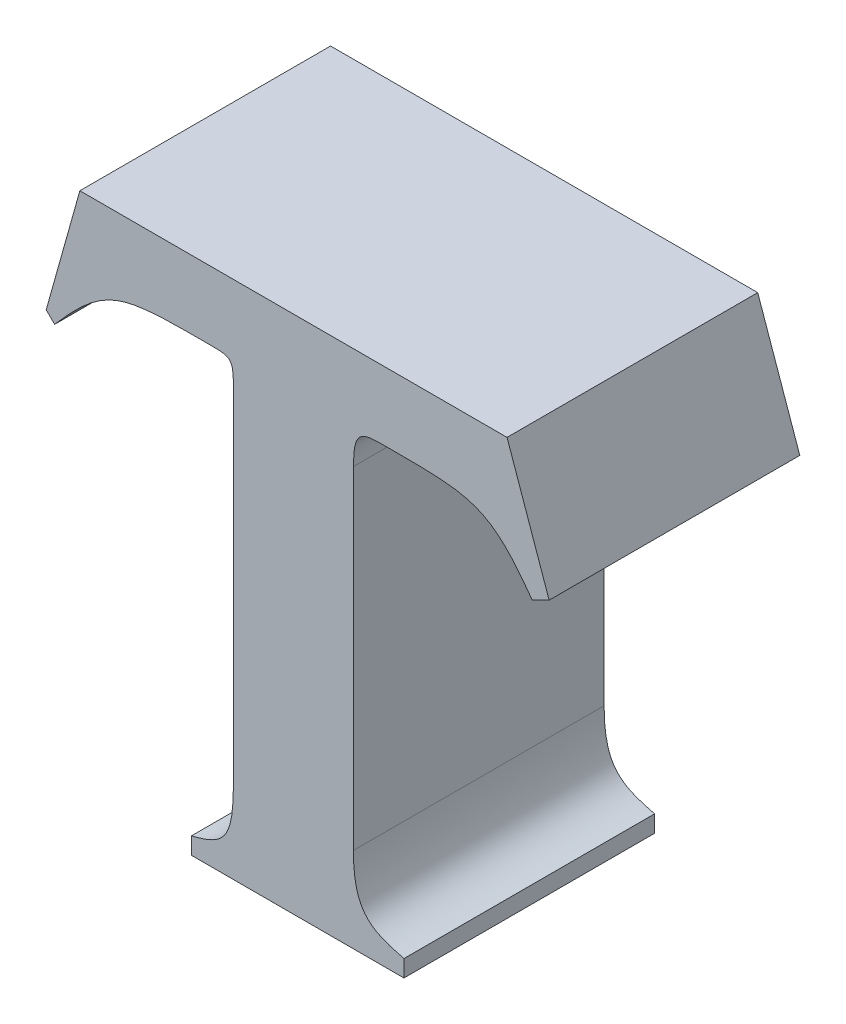
ISO-10303-21;
HEADER;
FILE_DESCRIPTION(('STEP AP214'),'2;1');
FILE_NAME('part.step','',(''),(''),'','','');
FILE_SCHEMA(('AUTOMOTIVE_DESIGN { 1 0 10303 214 1 1 1 1 }'));
ENDSEC;
DATA;
#1=APPLICATION_CONTEXT('core data for automotive mechanical design processes');
#2=APPLICATION_PROTOCOL_DEFINITION('international standard','automotive_design',2000,#1);
#3=PRODUCT_CONTEXT('',#1,'mechanical');
#4=PRODUCT('Part','Part','',(#3));
#5=PRODUCT_RELATED_PRODUCT_CATEGORY('part','',(#4));
#6=PRODUCT_DEFINITION_FORMATION('','',#4);
#7=PRODUCT_DEFINITION_CONTEXT('part definition',#1,'design');
#8=PRODUCT_DEFINITION('design','',#6,#7);
#9=PRODUCT_DEFINITION_SHAPE('','',#8);
#10=(LENGTH_UNIT() NAMED_UNIT(*) SI_UNIT(.MILLI.,.METRE.));
#11=(NAMED_UNIT(*) PLANE_ANGLE_UNIT() SI_UNIT($,.RADIAN.));
#12=(NAMED_UNIT(*) SI_UNIT($,.STERADIAN.) SOLID_ANGLE_UNIT());
#13=UNCERTAINTY_MEASURE_WITH_UNIT(LENGTH_MEASURE(1.E-05),#10,'distance_accuracy_value','');
#14=(GEOMETRIC_REPRESENTATION_CONTEXT(3) GLOBAL_UNCERTAINTY_ASSIGNED_CONTEXT((#13)) GLOBAL_UNIT_ASSIGNED_CONTEXT((#10,
#11,#12)) REPRESENTATION_CONTEXT('',''));
#15=CARTESIAN_POINT('',(0.,0.,0.));
#16=DIRECTION('',(0.,0.,1.));
#17=DIRECTION('',(1.,0.,0.));
#18=AXIS2_PLACEMENT_3D('',#15,#16,#17);
#19=CARTESIAN_POINT('',(1.345416638483,-0.25323453724898,0.));
#20=DIRECTION('',(-0.962788785252708,0.270254981437188,0.));
#21=DIRECTION('',(-0.270254981437188,-0.962788785252708,0.));
#22=AXIS2_PLACEMENT_3D('',#19,#20,#21);
#23=PLANE('',#22);
#24=DIRECTION('',(0.270254981437188,0.962788785252708,0.));
#25=VECTOR('',#24,1.);
#26=CARTESIAN_POINT('',(1.331985776334,-0.301082252706,0.));
#27=LINE('',#26,#25);
#28=CARTESIAN_POINT('',(1.331985776334,-0.301082252706,0.));
#29=VERTEX_POINT('',#28);
#30=CARTESIAN_POINT('',(1.345416638483,-0.25323453724898,0.));
#31=VERTEX_POINT('',#30);
#32=EDGE_CURVE('E11',#29,#31,#27,.T.);
#33=ORIENTED_EDGE('',*,*,#32,.F.);
#34=DIRECTION('',(0.,0.,1.));
#35=VECTOR('',#34,1.);
#36=CARTESIAN_POINT('',(1.331985776334,-0.301082252706,0.));
#37=LINE('',#36,#35);
#38=CARTESIAN_POINT('',(1.331985776334,-0.301082252706,0.1));
#39=VERTEX_POINT('',#38);
#40=EDGE_CURVE('E24',#29,#39,#37,.T.);
#41=ORIENTED_EDGE('',*,*,#40,.T.);
#42=DIRECTION('',(-0.270254981437188,-0.962788785252708,0.));
#43=VECTOR('',#42,1.);
#44=CARTESIAN_POINT('',(1.331985776334,-0.301082252706,0.1));
#45=LINE('',#44,#43);
#46=CARTESIAN_POINT('',(1.345416638483,-0.25323453724898,0.1));
#47=VERTEX_POINT('',#46);
#48=EDGE_CURVE('E148',#47,#39,#45,.T.);
#49=ORIENTED_EDGE('',*,*,#48,.F.);
#50=DIRECTION('',(0.,0.,1.));
#51=VECTOR('',#50,1.);
#52=CARTESIAN_POINT('',(1.345416638483,-0.25323453724898,0.));
#53=LINE('',#52,#51);
#54=EDGE_CURVE('E313',#31,#47,#53,.T.);
#55=ORIENTED_EDGE('',*,*,#54,.F.);
#56=EDGE_LOOP('',(#33,#41,#49,#55));
#57=FACE_BOUND('',#56,.T.);
#58=ADVANCED_FACE('F17',(#57),#23,.T.);
#59=CARTESIAN_POINT('',(1.515821228399,-0.25323453724898,0.));
#60=DIRECTION('',(0.,1.,0.));
#61=DIRECTION('',(-1.,0.,0.));
#62=AXIS2_PLACEMENT_3D('',#59,#60,#61);
#63=PLANE('',#62);
#64=DIRECTION('',(1.,0.,0.));
#65=VECTOR('',#64,1.);
#66=CARTESIAN_POINT('',(1.345416638483,-0.25323453724898,0.));
#67=LINE('',#66,#65);
#68=CARTESIAN_POINT('',(1.515821228399,-0.25323453724898,0.));
#69=VERTEX_POINT('',#68);
#70=EDGE_CURVE('E311',#31,#69,#67,.T.);
#71=ORIENTED_EDGE('',*,*,#70,.F.);
#72=ORIENTED_EDGE('',*,*,#54,.T.);
#73=DIRECTION('',(-1.,0.,0.));
#74=VECTOR('',#73,1.);
#75=CARTESIAN_POINT('',(1.345416638483,-0.25323453724898,0.1));
#76=LINE('',#75,#74);
#77=CARTESIAN_POINT('',(1.515821228399,-0.25323453724898,0.1));
#78=VERTEX_POINT('',#77);
#79=EDGE_CURVE('E309',#78,#47,#76,.T.);
#80=ORIENTED_EDGE('',*,*,#79,.F.);
#81=DIRECTION('',(0.,0.,1.));
#82=VECTOR('',#81,1.);
#83=CARTESIAN_POINT('',(1.515821228399,-0.25323453724898,0.));
#84=LINE('',#83,#82);
#85=EDGE_CURVE('E306',#69,#78,#84,.T.);
#86=ORIENTED_EDGE('',*,*,#85,.F.);
#87=EDGE_LOOP('',(#71,#72,#80,#86));
#88=FACE_BOUND('',#87,.T.);
#89=ADVANCED_FACE('F367',(#88),#63,.T.);
#90=CARTESIAN_POINT('',(1.532610196017,-0.301082252706,0.));
#91=DIRECTION('',(0.943598161348006,0.331092902220302,0.));
#92=DIRECTION('',(-0.331092902220302,0.943598161348006,0.));
#93=AXIS2_PLACEMENT_3D('',#90,#91,#92);
#94=PLANE('',#93);
#95=DIRECTION('',(0.331092902220302,-0.943598161348006,0.));
#96=VECTOR('',#95,1.);
#97=CARTESIAN_POINT('',(1.515821228399,-0.25323453724898,0.));
#98=LINE('',#97,#96);
#99=CARTESIAN_POINT('',(1.532610196017,-0.301082252706,0.));
#100=VERTEX_POINT('',#99);
#101=EDGE_CURVE('E304',#69,#100,#98,.T.);
#102=ORIENTED_EDGE('',*,*,#101,.F.);
#103=ORIENTED_EDGE('',*,*,#85,.T.);
#104=DIRECTION('',(-0.331092902220302,0.943598161348006,0.));
#105=VECTOR('',#104,1.);
#106=CARTESIAN_POINT('',(1.515821228399,-0.25323453724898,0.1));
#107=LINE('',#106,#105);
#108=CARTESIAN_POINT('',(1.532610196017,-0.301082252706,0.1));
#109=VERTEX_POINT('',#108);
#110=EDGE_CURVE('E301',#109,#78,#107,.T.);
#111=ORIENTED_EDGE('',*,*,#110,.F.);
#112=DIRECTION('',(0.,0.,1.));
#113=VECTOR('',#112,1.);
#114=CARTESIAN_POINT('',(1.532610196017,-0.301082252706,0.));
#115=LINE('',#114,#113);
#116=EDGE_CURVE('E298',#100,#109,#115,.T.);
#117=ORIENTED_EDGE('',*,*,#116,.F.);
#118=EDGE_LOOP('',(#102,#103,#111,#117));
#119=FACE_BOUND('',#118,.T.);
#120=ADVANCED_FACE('F363',(#119),#94,.T.);
#121=CARTESIAN_POINT('',(1.525894920917,-0.304439952646,0.));
#122=DIRECTION('',(0.447220243388609,-0.894423867024709,0.));
#123=DIRECTION('',(0.894423867024709,0.447220243388609,0.));
#124=AXIS2_PLACEMENT_3D('',#121,#122,#123);
#125=PLANE('',#124);
#126=DIRECTION('',(-0.894423867024708,-0.447220243388609,0.));
#127=VECTOR('',#126,1.);
#128=CARTESIAN_POINT('',(1.532610196017,-0.301082252706,0.));
#129=LINE('',#128,#127);
#130=CARTESIAN_POINT('',(1.525894920917,-0.304439952646,0.));
#131=VERTEX_POINT('',#130);
#132=EDGE_CURVE('E296',#100,#131,#129,.T.);
#133=ORIENTED_EDGE('',*,*,#132,.F.);
#134=ORIENTED_EDGE('',*,*,#116,.T.);
#135=DIRECTION('',(0.894423867024708,0.447220243388609,0.));
#136=VECTOR('',#135,1.);
#137=CARTESIAN_POINT('',(1.532610196017,-0.301082252706,0.1));
#138=LINE('',#137,#136);
#139=CARTESIAN_POINT('',(1.525894920917,-0.304439952646,0.1));
#140=VERTEX_POINT('',#139);
#141=EDGE_CURVE('E293',#140,#109,#138,.T.);
#142=ORIENTED_EDGE('',*,*,#141,.F.);
#143=DIRECTION('',(0.,0.,1.));
#144=VECTOR('',#143,1.);
#145=CARTESIAN_POINT('',(1.525894920917,-0.304439952646,0.));
#146=LINE('',#145,#144);
#147=EDGE_CURVE('E287',#131,#140,#146,.T.);
#148=ORIENTED_EDGE('',*,*,#147,.F.);
#149=EDGE_LOOP('',(#133,#134,#142,#148));
#150=FACE_BOUND('',#149,.T.);
#151=ADVANCED_FACE('F359',(#150),#125,.T.);
#152=CARTESIAN_POINT('',(1.467973294579,-0.28051607931998,0.));
#153=CARTESIAN_POINT('',(1.467973294579,-0.28051607931998,0.1));
#154=CARTESIAN_POINT('',(1.501971421927,-0.280516079319981,0.));
#155=CARTESIAN_POINT('',(1.501971421927,-0.280516079319981,0.1));
#156=CARTESIAN_POINT('',(1.508687008974,-0.28051607931998,0.));
#157=CARTESIAN_POINT('',(1.508687008974,-0.28051607931998,0.1));
#158=CARTESIAN_POINT('',(1.525894920917,-0.304439952646,0.));
#159=CARTESIAN_POINT('',(1.525894920917,-0.304439952646,0.1));
#160=B_SPLINE_SURFACE_WITH_KNOTS('',3,1,((#152,#153),(#154,#155),(#156,#157),(#158,#159)),
.UNSPECIFIED.,.F.,.F.,.F.,(4,4),(2,2),(-1.,0.),(0.,0.01),.UNSPECIFIED.);
#161=CARTESIAN_POINT('',(1.525894920917,-0.304439952646,0.));
#162=CARTESIAN_POINT('',(1.508687008974,-0.28051607931998,0.));
#163=CARTESIAN_POINT('',(1.501971421927,-0.280516079319981,0.));
#164=CARTESIAN_POINT('',(1.467973294579,-0.28051607931998,0.));
#165=B_SPLINE_CURVE_WITH_KNOTS('',3,(#161,#162,#163,#164),.UNSPECIFIED.,.F.,.F.,(4,4),(0.,1.),.UNSPECIFIED.);
#166=CARTESIAN_POINT('',(1.467973294579,-0.28051607931998,0.));
#167=VERTEX_POINT('',#166);
#168=EDGE_CURVE('E280',#131,#167,#165,.T.);
#169=CARTESIAN_POINT('',(1.467973294579,-0.28051607931998,0.1));
#170=CARTESIAN_POINT('',(1.501971421927,-0.280516079319981,0.1));
#171=CARTESIAN_POINT('',(1.508687008974,-0.28051607931998,0.1));
#172=CARTESIAN_POINT('',(1.525894920917,-0.304439952646,0.1));
#173=B_SPLINE_CURVE_WITH_KNOTS('',3,(#169,#170,#171,#172),.UNSPECIFIED.,.F.,.F.,(4,4),(-1.,0.),.UNSPECIFIED.);
#174=CARTESIAN_POINT('',(1.467973294579,-0.28051607931998,0.1));
#175=VERTEX_POINT('',#174);
#176=EDGE_CURVE('E275',#175,#140,#173,.T.);
#177=DIRECTION('',(0.,0.,1.));
#178=VECTOR('',#177,1.);
#179=CARTESIAN_POINT('',(1.467973294579,-0.28051607931998,0.));
#180=LINE('',#179,#178);
#181=EDGE_CURVE('E269',#167,#175,#180,.T.);
#182=ORIENTED_EDGE('',*,*,#168,.F.);
#183=ORIENTED_EDGE('',*,*,#147,.T.);
#184=ORIENTED_EDGE('',*,*,#176,.F.);
#185=ORIENTED_EDGE('',*,*,#181,.F.);
#186=EDGE_LOOP('',(#182,#183,#184,#185));
#187=FACE_BOUND('',#186,.T.);
#188=ADVANCED_FACE('F355',(#187),#160,.T.);
#189=CARTESIAN_POINT('',(1.454542744377,-0.29394706624691,0.));
#190=CARTESIAN_POINT('',(1.454542744377,-0.29394706624691,0.1));
#191=CARTESIAN_POINT('',(1.454542744377,-0.280516079319981,0.));
#192=CARTESIAN_POINT('',(1.454542744377,-0.280516079319981,0.1));
#193=CARTESIAN_POINT('',(1.457900849848,-0.280516079319981,0.));
#194=CARTESIAN_POINT('',(1.457900849848,-0.280516079319981,0.1));
#195=CARTESIAN_POINT('',(1.467973294579,-0.28051607931998,0.));
#196=CARTESIAN_POINT('',(1.467973294579,-0.28051607931998,0.1));
#197=B_SPLINE_SURFACE_WITH_KNOTS('',3,1,((#189,#190),(#191,#192),(#193,#194),(#195,#196)),
.UNSPECIFIED.,.F.,.F.,.F.,(4,4),(2,2),(-1.,0.),(0.,0.01),.UNSPECIFIED.);
#198=CARTESIAN_POINT('',(1.467973294579,-0.28051607931998,0.));
#199=CARTESIAN_POINT('',(1.457900849848,-0.280516079319981,0.));
#200=CARTESIAN_POINT('',(1.454542744377,-0.280516079319981,0.));
#201=CARTESIAN_POINT('',(1.454542744377,-0.29394706624691,0.));
#202=B_SPLINE_CURVE_WITH_KNOTS('',3,(#198,#199,#200,#201),.UNSPECIFIED.,.F.,.F.,(4,4),(0.,1.),.UNSPECIFIED.);
#203=CARTESIAN_POINT('',(1.454542744377,-0.29394706624691,0.));
#204=VERTEX_POINT('',#203);
#205=EDGE_CURVE('E262',#167,#204,#202,.T.);
#206=CARTESIAN_POINT('',(1.454542744377,-0.29394706624691,0.1));
#207=CARTESIAN_POINT('',(1.454542744377,-0.280516079319981,0.1));
#208=CARTESIAN_POINT('',(1.457900849848,-0.280516079319981,0.1));
#209=CARTESIAN_POINT('',(1.467973294579,-0.28051607931998,0.1));
#210=B_SPLINE_CURVE_WITH_KNOTS('',3,(#206,#207,#208,#209),.UNSPECIFIED.,.F.,.F.,(4,4),(-1.,0.),.UNSPECIFIED.);
#211=CARTESIAN_POINT('',(1.454542744377,-0.29394706624691,0.1));
#212=VERTEX_POINT('',#211);
#213=EDGE_CURVE('E257',#212,#175,#210,.T.);
#214=DIRECTION('',(0.,0.,1.));
#215=VECTOR('',#214,1.);
#216=CARTESIAN_POINT('',(1.454542744377,-0.29394706624691,0.));
#217=LINE('',#216,#215);
#218=EDGE_CURVE('E254',#204,#212,#217,.T.);
#219=ORIENTED_EDGE('',*,*,#205,.F.);
#220=ORIENTED_EDGE('',*,*,#181,.T.);
#221=ORIENTED_EDGE('',*,*,#213,.F.);
#222=ORIENTED_EDGE('',*,*,#218,.F.);
#223=EDGE_LOOP('',(#219,#220,#221,#222));
#224=FACE_BOUND('',#223,.T.);
#225=ADVANCED_FACE('F351',(#224),#197,.T.);
#226=CARTESIAN_POINT('',(1.454542744377,-0.426577508445,0.));
#227=DIRECTION('',(1.,0.,0.));
#228=DIRECTION('',(0.,1.,0.));
#229=AXIS2_PLACEMENT_3D('',#226,#227,#228);
#230=PLANE('',#229);
#231=DIRECTION('',(0.,-1.,0.));
#232=VECTOR('',#231,1.);
#233=CARTESIAN_POINT('',(1.454542744377,-0.29394706624691,0.));
#234=LINE('',#233,#232);
#235=CARTESIAN_POINT('',(1.454542744377,-0.426577508445,0.));
#236=VERTEX_POINT('',#235);
#237=EDGE_CURVE('E252',#204,#236,#234,.T.);
#238=ORIENTED_EDGE('',*,*,#237,.F.);
#239=ORIENTED_EDGE('',*,*,#218,.T.);
#240=DIRECTION('',(0.,1.,0.));
#241=VECTOR('',#240,1.);
#242=CARTESIAN_POINT('',(1.454542744377,-0.29394706624691,0.1));
#243=LINE('',#242,#241);
#244=CARTESIAN_POINT('',(1.454542744377,-0.426577508445,0.1));
#245=VERTEX_POINT('',#244);
#246=EDGE_CURVE('E249',#245,#212,#243,.T.);
#247=ORIENTED_EDGE('',*,*,#246,.F.);
#248=DIRECTION('',(0.,0.,1.));
#249=VECTOR('',#248,1.);
#250=CARTESIAN_POINT('',(1.454542744377,-0.426577508445,0.));
#251=LINE('',#250,#249);
#252=EDGE_CURVE('E243',#236,#245,#251,.T.);
#253=ORIENTED_EDGE('',*,*,#252,.F.);
#254=EDGE_LOOP('',(#238,#239,#247,#253));
#255=FACE_BOUND('',#254,.T.);
#256=ADVANCED_FACE('F347',(#255),#230,.T.);
#257=CARTESIAN_POINT('',(1.474688881626,-0.453859050516,0.));
#258=CARTESIAN_POINT('',(1.474688881626,-0.453859050516,0.1));
#259=CARTESIAN_POINT('',(1.461258019478,-0.450501256992,0.));
#260=CARTESIAN_POINT('',(1.461258019478,-0.450501256992,0.1));
#261=CARTESIAN_POINT('',(1.454542744377,-0.447143557053,0.));
#262=CARTESIAN_POINT('',(1.454542744377,-0.447143557053,0.1));
#263=CARTESIAN_POINT('',(1.454542744377,-0.426577508445,0.));
#264=CARTESIAN_POINT('',(1.454542744377,-0.426577508445,0.1));
#265=B_SPLINE_SURFACE_WITH_KNOTS('',3,1,((#257,#258),(#259,#260),(#261,#262),(#263,#264)),
.UNSPECIFIED.,.F.,.F.,.F.,(4,4),(2,2),(-1.,0.),(0.,0.01),.UNSPECIFIED.);
#266=CARTESIAN_POINT('',(1.454542744377,-0.426577508445,0.));
#267=CARTESIAN_POINT('',(1.454542744377,-0.447143557053,0.));
#268=CARTESIAN_POINT('',(1.461258019478,-0.450501256992,0.));
#269=CARTESIAN_POINT('',(1.474688881626,-0.453859050516,0.));
#270=B_SPLINE_CURVE_WITH_KNOTS('',3,(#266,#267,#268,#269),.UNSPECIFIED.,.F.,.F.,(4,4),(0.,1.),.UNSPECIFIED.);
#271=CARTESIAN_POINT('',(1.474688881626,-0.453859050516,0.));
#272=VERTEX_POINT('',#271);
#273=EDGE_CURVE('E236',#236,#272,#270,.T.);
#274=CARTESIAN_POINT('',(1.474688881626,-0.453859050516,0.1));
#275=CARTESIAN_POINT('',(1.461258019478,-0.450501256992,0.1));
#276=CARTESIAN_POINT('',(1.454542744377,-0.447143557053,0.1));
#277=CARTESIAN_POINT('',(1.454542744377,-0.426577508445,0.1));
#278=B_SPLINE_CURVE_WITH_KNOTS('',3,(#274,#275,#276,#277),.UNSPECIFIED.,.F.,.F.,(4,4),(-1.,0.),.UNSPECIFIED.);
#279=CARTESIAN_POINT('',(1.474688881626,-0.453859050516,0.1));
#280=VERTEX_POINT('',#279);
#281=EDGE_CURVE('E231',#280,#245,#278,.T.);
#282=DIRECTION('',(0.,0.,1.));
#283=VECTOR('',#282,1.);
#284=CARTESIAN_POINT('',(1.474688881626,-0.453859050516,0.));
#285=LINE('',#284,#283);
#286=EDGE_CURVE('E228',#272,#280,#285,.T.);
#287=ORIENTED_EDGE('',*,*,#273,.F.);
#288=ORIENTED_EDGE('',*,*,#252,.T.);
#289=ORIENTED_EDGE('',*,*,#281,.F.);
#290=ORIENTED_EDGE('',*,*,#286,.F.);
#291=EDGE_LOOP('',(#287,#288,#289,#290));
#292=FACE_BOUND('',#291,.T.);
#293=ADVANCED_FACE('F343',(#292),#265,.T.);
#294=CARTESIAN_POINT('',(1.474688881626,-0.46057454398,0.));
#295=DIRECTION('',(1.,0.,0.));
#296=DIRECTION('',(0.,1.,0.));
#297=AXIS2_PLACEMENT_3D('',#294,#295,#296);
#298=PLANE('',#297);
#299=DIRECTION('',(0.,-1.,0.));
#300=VECTOR('',#299,1.);
#301=CARTESIAN_POINT('',(1.474688881626,-0.453859050516,0.));
#302=LINE('',#301,#300);
#303=CARTESIAN_POINT('',(1.474688881626,-0.46057454398,0.));
#304=VERTEX_POINT('',#303);
#305=EDGE_CURVE('E226',#272,#304,#302,.T.);
#306=ORIENTED_EDGE('',*,*,#305,.F.);
#307=ORIENTED_EDGE('',*,*,#286,.T.);
#308=DIRECTION('',(0.,1.,0.));
#309=VECTOR('',#308,1.);
#310=CARTESIAN_POINT('',(1.474688881626,-0.453859050516,0.1));
#311=LINE('',#310,#309);
#312=CARTESIAN_POINT('',(1.474688881626,-0.46057454398,0.1));
#313=VERTEX_POINT('',#312);
#314=EDGE_CURVE('E223',#313,#280,#311,.T.);
#315=ORIENTED_EDGE('',*,*,#314,.F.);
#316=DIRECTION('',(0.,0.,1.));
#317=VECTOR('',#316,1.);
#318=CARTESIAN_POINT('',(1.474688881626,-0.46057454398,0.));
#319=LINE('',#318,#317);
#320=EDGE_CURVE('E220',#304,#313,#319,.T.);
#321=ORIENTED_EDGE('',*,*,#320,.F.);
#322=EDGE_LOOP('',(#306,#307,#315,#321));
#323=FACE_BOUND('',#322,.T.);
#324=ADVANCED_FACE('F339',(#323),#298,.T.);
#325=CARTESIAN_POINT('',(1.389907090725,-0.46057454398,0.));
#326=DIRECTION('',(0.,-1.,0.));
#327=DIRECTION('',(1.,0.,0.));
#328=AXIS2_PLACEMENT_3D('',#325,#326,#327);
#329=PLANE('',#328);
#330=DIRECTION('',(-1.,0.,0.));
#331=VECTOR('',#330,1.);
#332=CARTESIAN_POINT('',(1.474688881626,-0.46057454398,0.));
#333=LINE('',#332,#331);
#334=CARTESIAN_POINT('',(1.389907090725,-0.46057454398,0.));
#335=VERTEX_POINT('',#334);
#336=EDGE_CURVE('E218',#304,#335,#333,.T.);
#337=ORIENTED_EDGE('',*,*,#336,.F.);
#338=ORIENTED_EDGE('',*,*,#320,.T.);
#339=DIRECTION('',(1.,0.,0.));
#340=VECTOR('',#339,1.);
#341=CARTESIAN_POINT('',(1.474688881626,-0.46057454398,0.1));
#342=LINE('',#341,#340);
#343=CARTESIAN_POINT('',(1.389907090725,-0.46057454398,0.1));
#344=VERTEX_POINT('',#343);
#345=EDGE_CURVE('E215',#344,#313,#342,.T.);
#346=ORIENTED_EDGE('',*,*,#345,.F.);
#347=DIRECTION('',(0.,0.,1.));
#348=VECTOR('',#347,1.);
#349=CARTESIAN_POINT('',(1.389907090725,-0.46057454398,0.));
#350=LINE('',#349,#348);
#351=EDGE_CURVE('E212',#335,#344,#350,.T.);
#352=ORIENTED_EDGE('',*,*,#351,.F.);
#353=EDGE_LOOP('',(#337,#338,#346,#352));
#354=FACE_BOUND('',#353,.T.);
#355=ADVANCED_FACE('F335',(#354),#329,.T.);
#356=CARTESIAN_POINT('',(1.389907090725,-0.453859050516,0.));
#357=DIRECTION('',(-1.,0.,0.));
#358=DIRECTION('',(0.,-1.,0.));
#359=AXIS2_PLACEMENT_3D('',#356,#357,#358);
#360=PLANE('',#359);
#361=DIRECTION('',(0.,1.,0.));
#362=VECTOR('',#361,1.);
#363=CARTESIAN_POINT('',(1.389907090725,-0.46057454398,0.));
#364=LINE('',#363,#362);
#365=CARTESIAN_POINT('',(1.389907090725,-0.453859050516,0.));
#366=VERTEX_POINT('',#365);
#367=EDGE_CURVE('E210',#335,#366,#364,.T.);
#368=ORIENTED_EDGE('',*,*,#367,.F.);
#369=ORIENTED_EDGE('',*,*,#351,.T.);
#370=DIRECTION('',(0.,-1.,0.));
#371=VECTOR('',#370,1.);
#372=CARTESIAN_POINT('',(1.389907090725,-0.46057454398,0.1));
#373=LINE('',#372,#371);
#374=CARTESIAN_POINT('',(1.389907090725,-0.453859050516,0.1));
#375=VERTEX_POINT('',#374);
#376=EDGE_CURVE('E207',#375,#344,#373,.T.);
#377=ORIENTED_EDGE('',*,*,#376,.F.);
#378=DIRECTION('',(0.,0.,1.));
#379=VECTOR('',#378,1.);
#380=CARTESIAN_POINT('',(1.389907090725,-0.453859050516,0.));
#381=LINE('',#380,#379);
#382=EDGE_CURVE('E201',#366,#375,#381,.T.);
#383=ORIENTED_EDGE('',*,*,#382,.F.);
#384=EDGE_LOOP('',(#368,#369,#377,#383));
#385=FACE_BOUND('',#384,.T.);
#386=ADVANCED_FACE('F331',(#385),#360,.T.);
#387=CARTESIAN_POINT('',(1.406695122504,-0.426577508445,0.));
#388=CARTESIAN_POINT('',(1.406695122504,-0.426577508445,0.1));
#389=CARTESIAN_POINT('',(1.406695122504,-0.447143557053,0.));
#390=CARTESIAN_POINT('',(1.406695122504,-0.447143557053,0.1));
#391=CARTESIAN_POINT('',(1.403337952874,-0.450501256992,0.));
#392=CARTESIAN_POINT('',(1.403337952874,-0.450501256992,0.1));
#393=CARTESIAN_POINT('',(1.389907090725,-0.453859050516,0.));
#394=CARTESIAN_POINT('',(1.389907090725,-0.453859050516,0.1));
#395=B_SPLINE_SURFACE_WITH_KNOTS('',3,1,((#387,#388),(#389,#390),(#391,#392),(#393,#394)),
.UNSPECIFIED.,.F.,.F.,.F.,(4,4),(2,2),(-1.,0.),(0.,0.01),.UNSPECIFIED.);
#396=CARTESIAN_POINT('',(1.389907090725,-0.453859050516,0.));
#397=CARTESIAN_POINT('',(1.403337952874,-0.450501256992,0.));
#398=CARTESIAN_POINT('',(1.406695122504,-0.447143557053,0.));
#399=CARTESIAN_POINT('',(1.406695122504,-0.426577508445,0.));
#400=B_SPLINE_CURVE_WITH_KNOTS('',3,(#396,#397,#398,#399),.UNSPECIFIED.,.F.,.F.,(4,4),(0.,1.),.UNSPECIFIED.);
#401=CARTESIAN_POINT('',(1.406695122504,-0.426577508445,0.));
#402=VERTEX_POINT('',#401);
#403=EDGE_CURVE('E194',#366,#402,#400,.T.);
#404=CARTESIAN_POINT('',(1.406695122504,-0.426577508445,0.1));
#405=CARTESIAN_POINT('',(1.406695122504,-0.447143557053,0.1));
#406=CARTESIAN_POINT('',(1.403337952874,-0.450501256992,0.1));
#407=CARTESIAN_POINT('',(1.389907090725,-0.453859050516,0.1));
#408=B_SPLINE_CURVE_WITH_KNOTS('',3,(#404,#405,#406,#407),.UNSPECIFIED.,.F.,.F.,(4,4),(-1.,0.),.UNSPECIFIED.);
#409=CARTESIAN_POINT('',(1.406695122504,-0.426577508445,0.1));
#410=VERTEX_POINT('',#409);
#411=EDGE_CURVE('E189',#410,#375,#408,.T.);
#412=DIRECTION('',(0.,0.,1.));
#413=VECTOR('',#412,1.);
#414=CARTESIAN_POINT('',(1.406695122504,-0.426577508445,0.));
#415=LINE('',#414,#413);
#416=EDGE_CURVE('E186',#402,#410,#415,.T.);
#417=ORIENTED_EDGE('',*,*,#403,.F.);
#418=ORIENTED_EDGE('',*,*,#382,.T.);
#419=ORIENTED_EDGE('',*,*,#411,.F.);
#420=ORIENTED_EDGE('',*,*,#416,.F.);
#421=EDGE_LOOP('',(#417,#418,#419,#420));
#422=FACE_BOUND('',#421,.T.);
#423=ADVANCED_FACE('F327',(#422),#395,.T.);
#424=CARTESIAN_POINT('',(1.406695122504,-0.29394706624691,0.));
#425=DIRECTION('',(-1.,0.,0.));
#426=DIRECTION('',(0.,-1.,0.));
#427=AXIS2_PLACEMENT_3D('',#424,#425,#426);
#428=PLANE('',#427);
#429=DIRECTION('',(0.,1.,0.));
#430=VECTOR('',#429,1.);
#431=CARTESIAN_POINT('',(1.406695122504,-0.426577508445,0.));
#432=LINE('',#431,#430);
#433=CARTESIAN_POINT('',(1.406695122504,-0.29394706624691,0.));
#434=VERTEX_POINT('',#433);
#435=EDGE_CURVE('E184',#402,#434,#432,.T.);
#436=ORIENTED_EDGE('',*,*,#435,.F.);
#437=ORIENTED_EDGE('',*,*,#416,.T.);
#438=DIRECTION('',(0.,-1.,0.));
#439=VECTOR('',#438,1.);
#440=CARTESIAN_POINT('',(1.406695122504,-0.426577508445,0.1));
#441=LINE('',#440,#439);
#442=CARTESIAN_POINT('',(1.406695122504,-0.29394706624691,0.1));
#443=VERTEX_POINT('',#442);
#444=EDGE_CURVE('E181',#443,#410,#441,.T.);
#445=ORIENTED_EDGE('',*,*,#444,.F.);
#446=DIRECTION('',(0.,0.,1.));
#447=VECTOR('',#446,1.);
#448=CARTESIAN_POINT('',(1.406695122504,-0.29394706624691,0.));
#449=LINE('',#448,#447);
#450=EDGE_CURVE('E175',#434,#443,#449,.T.);
#451=ORIENTED_EDGE('',*,*,#450,.F.);
#452=EDGE_LOOP('',(#436,#437,#445,#451));
#453=FACE_BOUND('',#452,.T.);
#454=ADVANCED_FACE('F323',(#453),#428,.T.);
#455=CARTESIAN_POINT('',(1.396622677773,-0.28051607931998,0.));
#456=CARTESIAN_POINT('',(1.396622677773,-0.28051607931998,0.1));
#457=CARTESIAN_POINT('',(1.406695122504,-0.28051607931998,0.));
#458=CARTESIAN_POINT('',(1.406695122504,-0.28051607931998,0.1));
#459=CARTESIAN_POINT('',(1.406695122504,-0.28051607931998,0.));
#460=CARTESIAN_POINT('',(1.406695122504,-0.28051607931998,0.1));
#461=CARTESIAN_POINT('',(1.406695122504,-0.29394706624691,0.));
#462=CARTESIAN_POINT('',(1.406695122504,-0.29394706624691,0.1));
#463=B_SPLINE_SURFACE_WITH_KNOTS('',3,1,((#455,#456),(#457,#458),(#459,#460),(#461,#462)),
.UNSPECIFIED.,.F.,.F.,.F.,(4,4),(2,2),(-1.,0.),(0.,0.01),.UNSPECIFIED.);
#464=CARTESIAN_POINT('',(1.406695122504,-0.29394706624691,0.));
#465=CARTESIAN_POINT('',(1.406695122504,-0.28051607931998,0.));
#466=CARTESIAN_POINT('',(1.406695122504,-0.28051607931998,0.));
#467=CARTESIAN_POINT('',(1.396622677773,-0.28051607931998,0.));
#468=B_SPLINE_CURVE_WITH_KNOTS('',3,(#464,#465,#466,#467),.UNSPECIFIED.,.F.,.F.,(4,4),(0.,1.),.UNSPECIFIED.);
#469=CARTESIAN_POINT('',(1.396622677773,-0.28051607931998,0.));
#470=VERTEX_POINT('',#469);
#471=EDGE_CURVE('E168',#434,#470,#468,.T.);
#472=CARTESIAN_POINT('',(1.396622677773,-0.28051607931998,0.1));
#473=CARTESIAN_POINT('',(1.406695122504,-0.28051607931998,0.1));
#474=CARTESIAN_POINT('',(1.406695122504,-0.28051607931998,0.1));
#475=CARTESIAN_POINT('',(1.406695122504,-0.29394706624691,0.1));
#476=B_SPLINE_CURVE_WITH_KNOTS('',3,(#472,#473,#474,#475),.UNSPECIFIED.,.F.,.F.,(4,4),(-1.,0.),.UNSPECIFIED.);
#477=CARTESIAN_POINT('',(1.396622677773,-0.28051607931998,0.1));
#478=VERTEX_POINT('',#477);
#479=EDGE_CURVE('E164',#478,#443,#476,.T.);
#480=DIRECTION('',(0.,0.,1.));
#481=VECTOR('',#480,1.);
#482=CARTESIAN_POINT('',(1.396622677773,-0.28051607931998,0.));
#483=LINE('',#482,#481);
#484=EDGE_CURVE('E133',#470,#478,#483,.T.);
#485=ORIENTED_EDGE('',*,*,#471,.F.);
#486=ORIENTED_EDGE('',*,*,#450,.T.);
#487=ORIENTED_EDGE('',*,*,#479,.F.);
#488=ORIENTED_EDGE('',*,*,#484,.F.);
#489=EDGE_LOOP('',(#485,#486,#487,#488));
#490=FACE_BOUND('',#489,.T.);
#491=ADVANCED_FACE('F321',(#490),#463,.T.);
#492=CARTESIAN_POINT('',(1.335344193751,-0.304439952646,0.));
#493=CARTESIAN_POINT('',(1.335344193751,-0.304439952646,0.1));
#494=CARTESIAN_POINT('',(1.355908963378,-0.28051607931998,0.));
#495=CARTESIAN_POINT('',(1.355908963378,-0.28051607931998,0.1));
#496=CARTESIAN_POINT('',(1.362625486265,-0.280516079319981,0.));
#497=CARTESIAN_POINT('',(1.362625486265,-0.280516079319981,0.1));
#498=CARTESIAN_POINT('',(1.396622677773,-0.28051607931998,0.));
#499=CARTESIAN_POINT('',(1.396622677773,-0.28051607931998,0.1));
#500=B_SPLINE_SURFACE_WITH_KNOTS('',3,1,((#492,#493),(#494,#495),(#496,#497),(#498,#499)),
.UNSPECIFIED.,.F.,.F.,.F.,(4,4),(2,2),(-1.,0.),(0.,0.01),.UNSPECIFIED.);
#501=CARTESIAN_POINT('',(1.396622677773,-0.28051607931998,0.));
#502=CARTESIAN_POINT('',(1.362625486265,-0.280516079319981,0.));
#503=CARTESIAN_POINT('',(1.355908963378,-0.28051607931998,0.));
#504=CARTESIAN_POINT('',(1.335344193751,-0.304439952646,0.));
#505=B_SPLINE_CURVE_WITH_KNOTS('',3,(#501,#502,#503,#504),.UNSPECIFIED.,.F.,.F.,(4,4),(0.,1.),.UNSPECIFIED.);
#506=CARTESIAN_POINT('',(1.335344193751,-0.304439952646,0.));
#507=VERTEX_POINT('',#506);
#508=EDGE_CURVE('E137',#470,#507,#505,.T.);
#509=CARTESIAN_POINT('',(1.335344193751,-0.304439952646,0.1));
#510=CARTESIAN_POINT('',(1.355908963378,-0.28051607931998,0.1));
#511=CARTESIAN_POINT('',(1.362625486265,-0.280516079319981,0.1));
#512=CARTESIAN_POINT('',(1.396622677773,-0.28051607931998,0.1));
#513=B_SPLINE_CURVE_WITH_KNOTS('',3,(#509,#510,#511,#512),.UNSPECIFIED.,.F.,.F.,(4,4),(-1.,0.),.UNSPECIFIED.);
#514=CARTESIAN_POINT('',(1.335344193751,-0.304439952646,0.1));
#515=VERTEX_POINT('',#514);
#516=EDGE_CURVE('E126',#515,#478,#513,.T.);
#517=DIRECTION('',(0.,0.,1.));
#518=VECTOR('',#517,1.);
#519=CARTESIAN_POINT('',(1.335344193751,-0.304439952646,0.));
#520=LINE('',#519,#518);
#521=EDGE_CURVE('E130',#507,#515,#520,.T.);
#522=ORIENTED_EDGE('',*,*,#508,.F.);
#523=ORIENTED_EDGE('',*,*,#484,.T.);
#524=ORIENTED_EDGE('',*,*,#516,.F.);
#525=ORIENTED_EDGE('',*,*,#521,.F.);
#526=EDGE_LOOP('',(#522,#523,#524,#525));
#527=FACE_BOUND('',#526,.T.);
#528=ADVANCED_FACE('F129',(#527),#500,.T.);
#529=CARTESIAN_POINT('',(1.331985776334,-0.301082252706,0.));
#530=DIRECTION('',(-0.70703123754814,-0.707182316755125,0.));
#531=DIRECTION('',(0.707182316755125,-0.70703123754814,0.));
#532=AXIS2_PLACEMENT_3D('',#529,#530,#531);
#533=PLANE('',#532);
#534=DIRECTION('',(-0.707182316755125,0.70703123754814,0.));
#535=VECTOR('',#534,1.);
#536=CARTESIAN_POINT('',(1.335344193751,-0.304439952646,0.));
#537=LINE('',#536,#535);
#538=EDGE_CURVE('E143',#507,#29,#537,.T.);
#539=ORIENTED_EDGE('',*,*,#538,.F.);
#540=ORIENTED_EDGE('',*,*,#521,.T.);
#541=DIRECTION('',(0.707182316755125,-0.70703123754814,0.));
#542=VECTOR('',#541,1.);
#543=CARTESIAN_POINT('',(1.335344193751,-0.304439952646,0.1));
#544=LINE('',#543,#542);
#545=EDGE_CURVE('E142',#39,#515,#544,.T.);
#546=ORIENTED_EDGE('',*,*,#545,.F.);
#547=ORIENTED_EDGE('',*,*,#40,.F.);
#548=EDGE_LOOP('',(#539,#540,#546,#547));
#549=FACE_BOUND('',#548,.T.);
#550=ADVANCED_FACE('F141',(#549),#533,.T.);
#551=CARTESIAN_POINT('',(1.431516034793,-0.332930909708107,0.));
#552=DIRECTION('',(0.,0.,1.));
#553=DIRECTION('',(1.,0.,0.));
#554=AXIS2_PLACEMENT_3D('',#551,#552,#553);
#555=PLANE('',#554);
#556=ORIENTED_EDGE('',*,*,#538,.T.);
#557=ORIENTED_EDGE('',*,*,#32,.T.);
#558=ORIENTED_EDGE('',*,*,#70,.T.);
#559=ORIENTED_EDGE('',*,*,#101,.T.);
#560=ORIENTED_EDGE('',*,*,#132,.T.);
#561=ORIENTED_EDGE('',*,*,#168,.T.);
#562=ORIENTED_EDGE('',*,*,#205,.T.);
#563=ORIENTED_EDGE('',*,*,#237,.T.);
#564=ORIENTED_EDGE('',*,*,#273,.T.);
#565=ORIENTED_EDGE('',*,*,#305,.T.);
#566=ORIENTED_EDGE('',*,*,#336,.T.);
#567=ORIENTED_EDGE('',*,*,#367,.T.);
#568=ORIENTED_EDGE('',*,*,#403,.T.);
#569=ORIENTED_EDGE('',*,*,#435,.T.);
#570=ORIENTED_EDGE('',*,*,#471,.T.);
#571=ORIENTED_EDGE('',*,*,#508,.T.);
#572=EDGE_LOOP('',(#556,#557,#558,#559,#560,#561,#562,#563,#564,#565,#566,#567,#568,#569,#570,#571));
#573=FACE_BOUND('',#572,.T.);
#574=ADVANCED_FACE('F316',(#573),#555,.F.);
#575=CARTESIAN_POINT('',(1.431516034793,-0.332930909708107,0.1));
#576=DIRECTION('',(0.,0.,1.));
#577=DIRECTION('',(1.,0.,0.));
#578=AXIS2_PLACEMENT_3D('',#575,#576,#577);
#579=PLANE('',#578);
#580=ORIENTED_EDGE('',*,*,#545,.T.);
#581=ORIENTED_EDGE('',*,*,#516,.T.);
#582=ORIENTED_EDGE('',*,*,#479,.T.);
#583=ORIENTED_EDGE('',*,*,#444,.T.);
#584=ORIENTED_EDGE('',*,*,#411,.T.);
#585=ORIENTED_EDGE('',*,*,#376,.T.);
#586=ORIENTED_EDGE('',*,*,#345,.T.);
#587=ORIENTED_EDGE('',*,*,#314,.T.);
#588=ORIENTED_EDGE('',*,*,#281,.T.);
#589=ORIENTED_EDGE('',*,*,#246,.T.);
#590=ORIENTED_EDGE('',*,*,#213,.T.);
#591=ORIENTED_EDGE('',*,*,#176,.T.);
#592=ORIENTED_EDGE('',*,*,#141,.T.);
#593=ORIENTED_EDGE('',*,*,#110,.T.);
#594=ORIENTED_EDGE('',*,*,#79,.T.);
#595=ORIENTED_EDGE('',*,*,#48,.T.);
#596=EDGE_LOOP('',(#580,#581,#582,#583,#584,#585,#586,#587,#588,#589,#590,#591,#592,#593,#594,#595));
#597=FACE_BOUND('',#596,.T.);
#598=ADVANCED_FACE('F146',(#597),#579,.T.);
#599=CLOSED_SHELL('',(#58,#89,#120,#151,#188,#225,#256,#293,#324,#355,#386,#423,#454,#491,#528,
#550,#574,#598));
#600=MANIFOLD_SOLID_BREP('B1',#599);
#601=ADVANCED_BREP_SHAPE_REPRESENTATION('',(#18,#600),#14);
#602=SHAPE_DEFINITION_REPRESENTATION(#9,#601);
ENDSEC;
END-ISO-10303-21;
